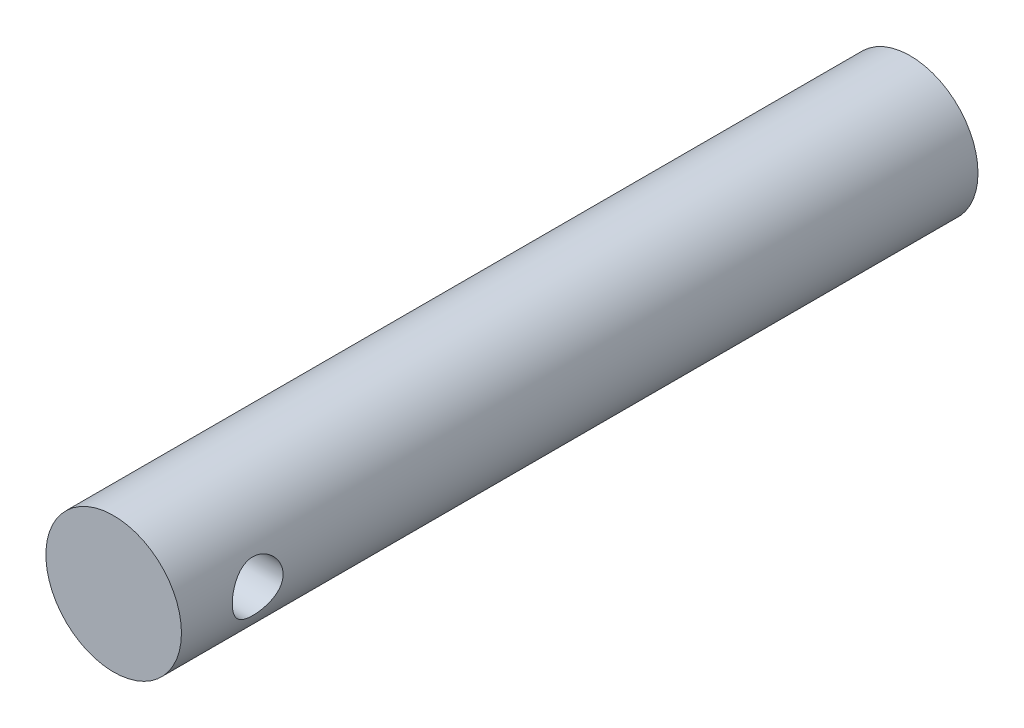
ISO-10303-21;
HEADER;
FILE_DESCRIPTION(('STEP AP214'),'2;1');
FILE_NAME('part.step','',(''),(''),'','','');
FILE_SCHEMA(('AUTOMOTIVE_DESIGN { 1 0 10303 214 1 1 1 1 }'));
ENDSEC;
DATA;
#1=APPLICATION_CONTEXT('core data for automotive mechanical design processes');
#2=APPLICATION_PROTOCOL_DEFINITION('international standard','automotive_design',2000,#1);
#3=PRODUCT_CONTEXT('',#1,'mechanical');
#4=PRODUCT('Part','Part','',(#3));
#5=PRODUCT_RELATED_PRODUCT_CATEGORY('part','',(#4));
#6=PRODUCT_DEFINITION_FORMATION('','',#4);
#7=PRODUCT_DEFINITION_CONTEXT('part definition',#1,'design');
#8=PRODUCT_DEFINITION('design','',#6,#7);
#9=PRODUCT_DEFINITION_SHAPE('','',#8);
#10=(LENGTH_UNIT() NAMED_UNIT(*) SI_UNIT(.MILLI.,.METRE.));
#11=(NAMED_UNIT(*) PLANE_ANGLE_UNIT() SI_UNIT($,.RADIAN.));
#12=(NAMED_UNIT(*) SI_UNIT($,.STERADIAN.) SOLID_ANGLE_UNIT());
#13=UNCERTAINTY_MEASURE_WITH_UNIT(LENGTH_MEASURE(1.E-05),#10,'distance_accuracy_value','');
#14=(GEOMETRIC_REPRESENTATION_CONTEXT(3) GLOBAL_UNCERTAINTY_ASSIGNED_CONTEXT((#13)) GLOBAL_UNIT_ASSIGNED_CONTEXT((#10,
#11,#12)) REPRESENTATION_CONTEXT('',''));
#15=CARTESIAN_POINT('',(0.,0.,0.));
#16=DIRECTION('',(0.,0.,1.));
#17=DIRECTION('',(1.,0.,0.));
#18=AXIS2_PLACEMENT_3D('',#15,#16,#17);
#19=CARTESIAN_POINT('',(0.,0.,47.));
#20=DIRECTION('',(0.,0.,-1.));
#21=DIRECTION('',(-1.,0.,0.));
#22=AXIS2_PLACEMENT_3D('',#19,#20,#21);
#23=CYLINDRICAL_SURFACE('',#22,4.);
#24=CARTESIAN_POINT('',(-4.,0.,41.));
#25=CARTESIAN_POINT('',(-4.00000217456151,0.0812350589378532,40.9999970976969));
#26=CARTESIAN_POINT('',(-3.99750379283184,0.162450241781792,41.0066197602484));
#27=CARTESIAN_POINT('',(-3.98778696006928,0.322453452352362,41.0328281952699));
#28=CARTESIAN_POINT('',(-3.98056918893993,0.401241827987617,41.0524121004706));
#29=CARTESIAN_POINT('',(-3.96218832391545,0.554060784990879,41.1037530017718));
#30=CARTESIAN_POINT('',(-3.9510328434944,0.628100224162276,41.1354865168218));
#31=CARTESIAN_POINT('',(-3.92588767765353,0.769799310160252,41.2101064130158));
#32=CARTESIAN_POINT('',(-3.91189723227548,0.83745723917788,41.2529957855442));
#33=CARTESIAN_POINT('',(-3.88186246971217,0.967346417045827,41.3506125310709));
#34=CARTESIAN_POINT('',(-3.86576002583566,1.02927073015119,41.4057302622594));
#35=CARTESIAN_POINT('',(-3.83360220871327,1.14324421474363,41.5254104346588));
#36=CARTESIAN_POINT('',(-3.81754685135033,1.19529036359203,41.5899757560879));
#37=CARTESIAN_POINT('',(-3.78662470617731,1.28998202215986,41.7297174675232));
#38=CARTESIAN_POINT('',(-3.77182648820818,1.3321939319576,41.8052043665458));
#39=CARTESIAN_POINT('',(-3.74599860237433,1.40318646334085,41.9628483541685));
#40=CARTESIAN_POINT('',(-3.73496742975881,1.43197244961239,42.0450027631551));
#41=CARTESIAN_POINT('',(-3.71854412824136,1.4740843101755,42.2101167402582));
#42=CARTESIAN_POINT('',(-3.71293924350838,1.48799593218558,42.2929050384354));
#43=CARTESIAN_POINT('',(-3.70738061461214,1.50179556531648,42.4598161579938));
#44=CARTESIAN_POINT('',(-3.70742453659304,1.50168936802631,42.5439384138745));
#45=CARTESIAN_POINT('',(-3.71297511632054,1.48790429610018,42.705769525213));
#46=CARTESIAN_POINT('',(-3.71815468871121,1.47503808509004,42.7835609060442));
#47=CARTESIAN_POINT('',(-3.73284938059529,1.4374416786833,42.9357871504053));
#48=CARTESIAN_POINT('',(-3.74236515298863,1.41270969663259,43.0102215066139));
#49=CARTESIAN_POINT('',(-3.76485702190253,1.35163748571904,43.1552770677282));
#50=CARTESIAN_POINT('',(-3.77789517988165,1.31508648737101,43.2257994861213));
#51=CARTESIAN_POINT('',(-3.80594210139319,1.23156073762698,43.359945737591));
#52=CARTESIAN_POINT('',(-3.82095154457158,1.18458238728897,43.4235671775197));
#53=CARTESIAN_POINT('',(-3.85248038859113,1.07781780766549,43.5466036636509));
#54=CARTESIAN_POINT('',(-3.86903347455671,1.01738298716956,43.6054486407481));
#55=CARTESIAN_POINT('',(-3.90091728164085,0.887312590819022,43.7123379662058));
#56=CARTESIAN_POINT('',(-3.91624781465952,0.817675603497365,43.7603806546057));
#57=CARTESIAN_POINT('',(-3.9442639480908,0.669723436992419,43.8449303970625));
#58=CARTESIAN_POINT('',(-3.95690498259616,0.591290713844718,43.8812475812211));
#59=CARTESIAN_POINT('',(-3.97778718326962,0.428836850524583,43.93998260427));
#60=CARTESIAN_POINT('',(-3.98603030341493,0.344818210845768,43.9624066165611));
#61=CARTESIAN_POINT('',(-3.99684443228065,0.178375243148666,43.9916227875419));
#62=CARTESIAN_POINT('',(-3.99969369025686,0.0961036195622103,43.9991826063825));
#63=CARTESIAN_POINT('',(-4.00025893700126,-0.0685724752550237,44.0006910638999));
#64=CARTESIAN_POINT('',(-3.99797606386863,-0.150976912983372,43.9946427203168));
#65=CARTESIAN_POINT('',(-3.98871709772643,-0.310262048561859,43.9696899576913));
#66=CARTESIAN_POINT('',(-3.98192470962305,-0.387233328007336,43.9512884562629));
#67=CARTESIAN_POINT('',(-3.96451477091717,-0.536941754957222,43.9028139274527));
#68=CARTESIAN_POINT('',(-3.9538967228203,-0.609678350347535,43.872739382052));
#69=CARTESIAN_POINT('',(-3.92949624407681,-0.751247765110156,43.8008135875605));
#70=CARTESIAN_POINT('',(-3.91563000209348,-0.819903083557796,43.7586422707766));
#71=CARTESIAN_POINT('',(-3.88626671564664,-0.949392711726627,43.6640818968284));
#72=CARTESIAN_POINT('',(-3.87076907009516,-1.01022412027045,43.6116890674549));
#73=CARTESIAN_POINT('',(-3.83873329490989,-1.12603079874454,43.4945958778757));
#74=CARTESIAN_POINT('',(-3.82218696503729,-1.18046154123569,43.4293578172273));
#75=CARTESIAN_POINT('',(-3.79078815746854,-1.27771050031903,43.2903486152924));
#76=CARTESIAN_POINT('',(-3.77593583194399,-1.32052767414519,43.2165767086115));
#77=CARTESIAN_POINT('',(-3.74966829822463,-1.39337773518998,43.0619840132277));
#78=CARTESIAN_POINT('',(-3.73826760328493,-1.42335685446918,42.9811352540896));
#79=CARTESIAN_POINT('',(-3.72054032891005,-1.46907883466889,42.8149902363122));
#80=CARTESIAN_POINT('',(-3.71421061057491,-1.48483050305535,42.7296967638019));
#81=CARTESIAN_POINT('',(-3.70775894792573,-1.50086347097839,42.5629838404589));
#82=CARTESIAN_POINT('',(-3.70726444523341,-1.50207331495838,42.4816673682831));
#83=CARTESIAN_POINT('',(-3.71158412745292,-1.49136715641593,42.3200546837239));
#84=CARTESIAN_POINT('',(-3.71639780898899,-1.47945239850124,42.2397583753284));
#85=CARTESIAN_POINT('',(-3.73048141585432,-1.44355815630242,42.0849527732835));
#86=CARTESIAN_POINT('',(-3.73961085376663,-1.41995798316525,42.0103416537547));
#87=CARTESIAN_POINT('',(-3.76121548297845,-1.3616969677992,41.8660944915056));
#88=CARTESIAN_POINT('',(-3.77369151995215,-1.32703332944945,41.7964597119299));
#89=CARTESIAN_POINT('',(-3.80139723903965,-1.24552075938154,41.6601732103024));
#90=CARTESIAN_POINT('',(-3.81673698440964,-1.1981283280301,41.5938692032001));
#91=CARTESIAN_POINT('',(-3.84806246757177,-1.09334485729906,41.4698584390288));
#92=CARTESIAN_POINT('',(-3.86404840943145,-1.03595064012808,41.4121544252132));
#93=CARTESIAN_POINT('',(-3.89590424609881,-0.909080396784624,41.3037980441782));
#94=CARTESIAN_POINT('',(-3.91172104900645,-0.839118644212995,41.2536962465653));
#95=CARTESIAN_POINT('',(-3.9405451445703,-0.691213223200825,41.1659773447234));
#96=CARTESIAN_POINT('',(-3.95355221851559,-0.613268934090626,41.1283612122636));
#97=CARTESIAN_POINT('',(-3.9757429260668,-0.447999082002316,41.0656231709517));
#98=CARTESIAN_POINT('',(-3.98473657158356,-0.360413422234213,41.0411129353981));
#99=CARTESIAN_POINT('',(-3.99686242179587,-0.181875733606385,41.0083070400793));
#100=CARTESIAN_POINT('',(-3.99999756603967,-0.0909254163648602,41.0000032485127));
#101=CARTESIAN_POINT('',(-4.,0.,41.));
#102=B_SPLINE_CURVE_WITH_KNOTS('',3,(#24,#25,#26,#27,#28,#29,#30,#31,#32,#33,#34,#35,#36,#37,
#38,#39,#40,#41,#42,#43,#44,#45,#46,#47,#48,#49,#50,#51,#52,#53,#54,#55,#56,#57,#58,#59,#60,#61,
#62,#63,#64,#65,#66,#67,#68,#69,#70,#71,#72,#73,#74,#75,#76,#77,#78,#79,#80,#81,#82,#83,#84,#85,
#86,#87,#88,#89,#90,#91,#92,#93,#94,#95,#96,#97,#98,#99,#100,#101),.UNSPECIFIED.,.T.,.F.,(4,2,2,
2,2,2,2,2,2,2,2,2,2,2,2,2,2,2,2,2,2,2,2,2,2,2,2,2,2,2,2,2,2,2,2,2,2,2,4),(0.,0.24336980156056,
0.486704549530461,0.72957136921357,0.97250337960949,1.22473618582715,1.47704604925622,
1.73896674501659,2.00078269352134,2.25185874416902,2.50283106079709,2.73878345119972,
2.97477138060589,3.21522408387019,3.4557599074426,3.71246153335814,3.96920257905067,
4.22991375286077,4.49050899698847,4.73725019635927,4.98393668390522,5.22114437923841,
5.45838293254455,5.70259221859601,5.94689180019869,6.20536519455659,6.46386178920143,
6.72343066727205,6.98283874956508,7.22558763480253,7.4683135021126,7.70363142426536,
7.93900886656509,8.18672471884274,8.43451941997064,8.69572329654042,8.95694749805104,
9.22948515032045,9.5018860179613),.UNSPECIFIED.);
#103=CARTESIAN_POINT('',(-4.,0.,41.));
#104=VERTEX_POINT('',#103);
#105=EDGE_CURVE('E10',#104,#104,#102,.T.);
#106=ORIENTED_EDGE('',*,*,#105,.T.);
#107=EDGE_LOOP('',(#106));
#108=FACE_BOUND('',#107,.T.);
#109=CARTESIAN_POINT('',(4.,0.,41.));
#110=CARTESIAN_POINT('',(4.00000217456151,-0.0812350589378532,40.9999970976969));
#111=CARTESIAN_POINT('',(3.99750379283184,-0.162450241781792,41.0066197602484));
#112=CARTESIAN_POINT('',(3.98778696006928,-0.322453452352362,41.0328281952699));
#113=CARTESIAN_POINT('',(3.98056918893993,-0.401241827987617,41.0524121004706));
#114=CARTESIAN_POINT('',(3.96218832391545,-0.554060784990879,41.1037530017718));
#115=CARTESIAN_POINT('',(3.9510328434944,-0.628100224162276,41.1354865168218));
#116=CARTESIAN_POINT('',(3.92588767765353,-0.769799310160252,41.2101064130158));
#117=CARTESIAN_POINT('',(3.91189723227548,-0.83745723917788,41.2529957855442));
#118=CARTESIAN_POINT('',(3.88186246971217,-0.967346417045827,41.3506125310709));
#119=CARTESIAN_POINT('',(3.86576002583566,-1.02927073015119,41.4057302622594));
#120=CARTESIAN_POINT('',(3.83360220871327,-1.14324421474363,41.5254104346588));
#121=CARTESIAN_POINT('',(3.81754685135033,-1.19529036359203,41.5899757560879));
#122=CARTESIAN_POINT('',(3.78662470617731,-1.28998202215986,41.7297174675232));
#123=CARTESIAN_POINT('',(3.77182648820818,-1.3321939319576,41.8052043665458));
#124=CARTESIAN_POINT('',(3.74599860237433,-1.40318646334085,41.9628483541685));
#125=CARTESIAN_POINT('',(3.73496742975881,-1.43197244961239,42.0450027631551));
#126=CARTESIAN_POINT('',(3.71854412824136,-1.4740843101755,42.2101167402582));
#127=CARTESIAN_POINT('',(3.71293924350838,-1.48799593218558,42.2929050384354));
#128=CARTESIAN_POINT('',(3.70738061461214,-1.50179556531648,42.4598161579938));
#129=CARTESIAN_POINT('',(3.70742453659304,-1.50168936802631,42.5439384138745));
#130=CARTESIAN_POINT('',(3.71297511632054,-1.48790429610018,42.705769525213));
#131=CARTESIAN_POINT('',(3.71815468871121,-1.47503808509004,42.7835609060442));
#132=CARTESIAN_POINT('',(3.73284938059529,-1.4374416786833,42.9357871504053));
#133=CARTESIAN_POINT('',(3.74236515298863,-1.41270969663259,43.0102215066139));
#134=CARTESIAN_POINT('',(3.76485702190253,-1.35163748571904,43.1552770677282));
#135=CARTESIAN_POINT('',(3.77789517988165,-1.31508648737101,43.2257994861213));
#136=CARTESIAN_POINT('',(3.80594210139319,-1.23156073762698,43.359945737591));
#137=CARTESIAN_POINT('',(3.82095154457158,-1.18458238728897,43.4235671775197));
#138=CARTESIAN_POINT('',(3.85248038859113,-1.07781780766549,43.5466036636509));
#139=CARTESIAN_POINT('',(3.86903347455671,-1.01738298716956,43.6054486407481));
#140=CARTESIAN_POINT('',(3.90091728164085,-0.887312590819022,43.7123379662058));
#141=CARTESIAN_POINT('',(3.91624781465952,-0.817675603497365,43.7603806546057));
#142=CARTESIAN_POINT('',(3.9442639480908,-0.669723436992419,43.8449303970625));
#143=CARTESIAN_POINT('',(3.95690498259616,-0.591290713844718,43.8812475812211));
#144=CARTESIAN_POINT('',(3.97778718326962,-0.428836850524583,43.93998260427));
#145=CARTESIAN_POINT('',(3.98603030341493,-0.344818210845768,43.9624066165611));
#146=CARTESIAN_POINT('',(3.99684443228065,-0.178375243148666,43.9916227875419));
#147=CARTESIAN_POINT('',(3.99969369025686,-0.0961036195622103,43.9991826063825));
#148=CARTESIAN_POINT('',(4.00025893700126,0.0685724752550237,44.0006910638999));
#149=CARTESIAN_POINT('',(3.99797606386863,0.150976912983372,43.9946427203168));
#150=CARTESIAN_POINT('',(3.98871709772643,0.310262048561859,43.9696899576913));
#151=CARTESIAN_POINT('',(3.98192470962305,0.387233328007336,43.9512884562629));
#152=CARTESIAN_POINT('',(3.96451477091717,0.536941754957222,43.9028139274527));
#153=CARTESIAN_POINT('',(3.9538967228203,0.609678350347535,43.872739382052));
#154=CARTESIAN_POINT('',(3.92949624407681,0.751247765110156,43.8008135875605));
#155=CARTESIAN_POINT('',(3.91563000209348,0.819903083557796,43.7586422707766));
#156=CARTESIAN_POINT('',(3.88626671564664,0.949392711726627,43.6640818968284));
#157=CARTESIAN_POINT('',(3.87076907009516,1.01022412027045,43.6116890674549));
#158=CARTESIAN_POINT('',(3.83873329490989,1.12603079874454,43.4945958778757));
#159=CARTESIAN_POINT('',(3.82218696503729,1.18046154123569,43.4293578172273));
#160=CARTESIAN_POINT('',(3.79078815746854,1.27771050031903,43.2903486152924));
#161=CARTESIAN_POINT('',(3.77593583194399,1.32052767414519,43.2165767086115));
#162=CARTESIAN_POINT('',(3.74966829822463,1.39337773518998,43.0619840132277));
#163=CARTESIAN_POINT('',(3.73826760328493,1.42335685446918,42.9811352540896));
#164=CARTESIAN_POINT('',(3.72054032891005,1.46907883466889,42.8149902363122));
#165=CARTESIAN_POINT('',(3.71421061057491,1.48483050305535,42.7296967638019));
#166=CARTESIAN_POINT('',(3.70775894792573,1.50086347097839,42.5629838404589));
#167=CARTESIAN_POINT('',(3.70726444523341,1.50207331495838,42.4816673682831));
#168=CARTESIAN_POINT('',(3.71158412745292,1.49136715641593,42.3200546837239));
#169=CARTESIAN_POINT('',(3.71639780898899,1.47945239850124,42.2397583753284));
#170=CARTESIAN_POINT('',(3.73048141585432,1.44355815630242,42.0849527732835));
#171=CARTESIAN_POINT('',(3.73961085376663,1.41995798316525,42.0103416537547));
#172=CARTESIAN_POINT('',(3.76121548297845,1.3616969677992,41.8660944915056));
#173=CARTESIAN_POINT('',(3.77369151995215,1.32703332944945,41.7964597119299));
#174=CARTESIAN_POINT('',(3.80139723903965,1.24552075938154,41.6601732103024));
#175=CARTESIAN_POINT('',(3.81673698440964,1.1981283280301,41.5938692032001));
#176=CARTESIAN_POINT('',(3.84806246757177,1.09334485729906,41.4698584390288));
#177=CARTESIAN_POINT('',(3.86404840943145,1.03595064012808,41.4121544252132));
#178=CARTESIAN_POINT('',(3.89590424609881,0.909080396784624,41.3037980441782));
#179=CARTESIAN_POINT('',(3.91172104900645,0.839118644212995,41.2536962465653));
#180=CARTESIAN_POINT('',(3.9405451445703,0.691213223200825,41.1659773447234));
#181=CARTESIAN_POINT('',(3.95355221851559,0.613268934090626,41.1283612122636));
#182=CARTESIAN_POINT('',(3.9757429260668,0.447999082002316,41.0656231709517));
#183=CARTESIAN_POINT('',(3.98473657158356,0.360413422234213,41.0411129353981));
#184=CARTESIAN_POINT('',(3.99686242179587,0.181875733606385,41.0083070400793));
#185=CARTESIAN_POINT('',(3.99999756603967,0.0909254163648602,41.0000032485127));
#186=CARTESIAN_POINT('',(4.,0.,41.));
#187=B_SPLINE_CURVE_WITH_KNOTS('',3,(#109,#110,#111,#112,#113,#114,#115,#116,#117,#118,#119,
#120,#121,#122,#123,#124,#125,#126,#127,#128,#129,#130,#131,#132,#133,#134,#135,#136,#137,#138,
#139,#140,#141,#142,#143,#144,#145,#146,#147,#148,#149,#150,#151,#152,#153,#154,#155,#156,#157,
#158,#159,#160,#161,#162,#163,#164,#165,#166,#167,#168,#169,#170,#171,#172,#173,#174,#175,#176,
#177,#178,#179,#180,#181,#182,#183,#184,#185,#186),.UNSPECIFIED.,.T.,.F.,(4,2,2,2,2,2,2,2,2,2,2,
2,2,2,2,2,2,2,2,2,2,2,2,2,2,2,2,2,2,2,2,2,2,2,2,2,2,2,4),(0.,0.24336980156056,0.486704549530461,
0.72957136921357,0.97250337960949,1.22473618582715,1.47704604925622,1.73896674501659,
2.00078269352134,2.25185874416902,2.50283106079709,2.73878345119972,2.97477138060589,
3.21522408387019,3.4557599074426,3.71246153335814,3.96920257905067,4.22991375286077,
4.49050899698847,4.73725019635927,4.98393668390522,5.22114437923841,5.45838293254455,
5.70259221859601,5.94689180019869,6.20536519455659,6.46386178920143,6.72343066727205,
6.98283874956508,7.22558763480253,7.4683135021126,7.70363142426536,7.93900886656509,
8.18672471884274,8.43451941997064,8.69572329654042,8.95694749805104,9.22948515032045,
9.5018860179613),.UNSPECIFIED.);
#188=CARTESIAN_POINT('',(4.,0.,41.));
#189=VERTEX_POINT('',#188);
#190=EDGE_CURVE('E40',#189,#189,#187,.T.);
#191=ORIENTED_EDGE('',*,*,#190,.T.);
#192=EDGE_LOOP('',(#191));
#193=FACE_BOUND('',#192,.T.);
#194=CARTESIAN_POINT('',(0.,0.,47.));
#195=DIRECTION('',(0.,0.,1.));
#196=DIRECTION('',(1.,0.,0.));
#197=AXIS2_PLACEMENT_3D('',#194,#195,#196);
#198=CIRCLE('',#197,4.);
#199=CARTESIAN_POINT('',(4.,0.,47.));
#200=VERTEX_POINT('',#199);
#201=EDGE_CURVE('E44',#200,#200,#198,.T.);
#202=ORIENTED_EDGE('',*,*,#201,.F.);
#203=EDGE_LOOP('',(#202));
#204=FACE_BOUND('',#203,.T.);
#205=CARTESIAN_POINT('',(0.,0.,0.));
#206=DIRECTION('',(0.,0.,1.));
#207=DIRECTION('',(1.,0.,0.));
#208=AXIS2_PLACEMENT_3D('',#205,#206,#207);
#209=CIRCLE('',#208,4.);
#210=CARTESIAN_POINT('',(4.,0.,0.));
#211=VERTEX_POINT('',#210);
#212=EDGE_CURVE('E48',#211,#211,#209,.T.);
#213=ORIENTED_EDGE('',*,*,#212,.T.);
#214=EDGE_LOOP('',(#213));
#215=FACE_BOUND('',#214,.T.);
#216=ADVANCED_FACE('F30',(#108,#193,#204,#215),#23,.T.);
#217=CARTESIAN_POINT('',(0.,0.,47.));
#218=DIRECTION('',(0.,0.,1.));
#219=DIRECTION('',(1.,0.,0.));
#220=AXIS2_PLACEMENT_3D('',#217,#218,#219);
#221=PLANE('',#220);
#222=ORIENTED_EDGE('',*,*,#201,.T.);
#223=EDGE_LOOP('',(#222));
#224=FACE_BOUND('',#223,.T.);
#225=ADVANCED_FACE('F59',(#224),#221,.T.);
#226=CARTESIAN_POINT('',(0.,0.,0.));
#227=DIRECTION('',(0.,0.,1.));
#228=DIRECTION('',(1.,0.,0.));
#229=AXIS2_PLACEMENT_3D('',#226,#227,#228);
#230=PLANE('',#229);
#231=ORIENTED_EDGE('',*,*,#212,.F.);
#232=EDGE_LOOP('',(#231));
#233=FACE_BOUND('',#232,.T.);
#234=ADVANCED_FACE('F57',(#233),#230,.F.);
#235=CARTESIAN_POINT('',(-4.,0.,42.5));
#236=DIRECTION('',(1.,0.,0.));
#237=DIRECTION('',(0.,0.,-1.));
#238=AXIS2_PLACEMENT_3D('',#235,#236,#237);
#239=CYLINDRICAL_SURFACE('',#238,1.5);
#240=ORIENTED_EDGE('',*,*,#190,.F.);
#241=EDGE_LOOP('',(#240));
#242=FACE_BOUND('',#241,.T.);
#243=ORIENTED_EDGE('',*,*,#105,.F.);
#244=EDGE_LOOP('',(#243));
#245=FACE_BOUND('',#244,.T.);
#246=ADVANCED_FACE('F53',(#242,#245),#239,.F.);
#247=CLOSED_SHELL('',(#216,#225,#234,#246));
#248=MANIFOLD_SOLID_BREP('B2',#247);
#249=ADVANCED_BREP_SHAPE_REPRESENTATION('',(#18,#248),#14);
#250=SHAPE_DEFINITION_REPRESENTATION(#9,#249);
ENDSEC;
END-ISO-10303-21;
